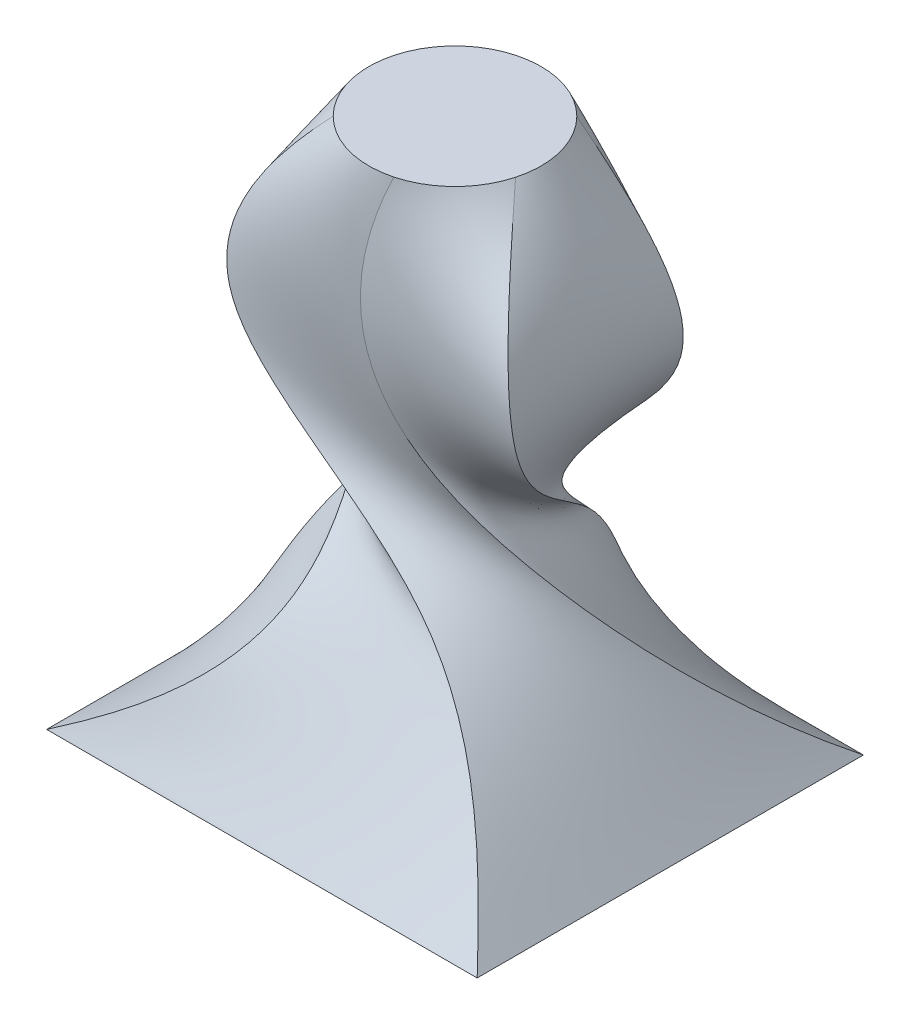
ISO-10303-21;
HEADER;
FILE_DESCRIPTION(('STEP AP214'),'2;1');
FILE_NAME('part.step','',(''),(''),'','','');
FILE_SCHEMA(('AUTOMOTIVE_DESIGN { 1 0 10303 214 1 1 1 1 }'));
ENDSEC;
DATA;
#1=APPLICATION_CONTEXT('core data for automotive mechanical design processes');
#2=APPLICATION_PROTOCOL_DEFINITION('international standard','automotive_design',2000,#1);
#3=PRODUCT_CONTEXT('',#1,'mechanical');
#4=PRODUCT('Part','Part','',(#3));
#5=PRODUCT_RELATED_PRODUCT_CATEGORY('part','',(#4));
#6=PRODUCT_DEFINITION_FORMATION('','',#4);
#7=PRODUCT_DEFINITION_CONTEXT('part definition',#1,'design');
#8=PRODUCT_DEFINITION('design','',#6,#7);
#9=PRODUCT_DEFINITION_SHAPE('','',#8);
#10=(LENGTH_UNIT() NAMED_UNIT(*) SI_UNIT(.MILLI.,.METRE.));
#11=(NAMED_UNIT(*) PLANE_ANGLE_UNIT() SI_UNIT($,.RADIAN.));
#12=(NAMED_UNIT(*) SI_UNIT($,.STERADIAN.) SOLID_ANGLE_UNIT());
#13=UNCERTAINTY_MEASURE_WITH_UNIT(LENGTH_MEASURE(1.E-05),#10,'distance_accuracy_value','');
#14=(GEOMETRIC_REPRESENTATION_CONTEXT(3) GLOBAL_UNCERTAINTY_ASSIGNED_CONTEXT((#13)) GLOBAL_UNIT_ASSIGNED_CONTEXT((#10,
#11,#12)) REPRESENTATION_CONTEXT('',''));
#15=CARTESIAN_POINT('',(0.,0.,0.));
#16=DIRECTION('',(0.,0.,1.));
#17=DIRECTION('',(1.,0.,0.));
#18=AXIS2_PLACEMENT_3D('',#15,#16,#17);
#19=CARTESIAN_POINT('',(0.,150.,0.));
#20=DIRECTION('',(0.,1.,0.));
#21=DIRECTION('',(0.,0.,1.));
#22=AXIS2_PLACEMENT_3D('',#19,#20,#21);
#23=PLANE('',#22);
#24=CARTESIAN_POINT('',(0.,150.,0.));
#25=DIRECTION('',(0.,1.,0.));
#26=DIRECTION('',(0.,0.,1.));
#27=AXIS2_PLACEMENT_3D('',#24,#25,#26);
#28=CIRCLE('',#27,23.8337887628549);
#29=CARTESIAN_POINT('',(-16.9034555283917,150.,16.8024604743494));
#30=VERTEX_POINT('',#29);
#31=CARTESIAN_POINT('',(6.09962985267464,150.,23.0400521365024));
#32=VERTEX_POINT('',#31);
#33=EDGE_CURVE('E12',#30,#32,#28,.T.);
#34=ORIENTED_EDGE('',*,*,#33,.T.);
#35=CARTESIAN_POINT('',(23.0030853810664,150.,6.23759166215305));
#36=VERTEX_POINT('',#35);
#37=EDGE_CURVE('E89',#32,#36,#28,.T.);
#38=ORIENTED_EDGE('',*,*,#37,.T.);
#39=CARTESIAN_POINT('',(16.9034555283917,150.,-16.8024604743494));
#40=VERTEX_POINT('',#39);
#41=EDGE_CURVE('E361',#36,#40,#28,.T.);
#42=ORIENTED_EDGE('',*,*,#41,.T.);
#43=CARTESIAN_POINT('',(-6.09962985267461,150.,-23.0400521365024));
#44=VERTEX_POINT('',#43);
#45=EDGE_CURVE('E103',#40,#44,#28,.T.);
#46=ORIENTED_EDGE('',*,*,#45,.T.);
#47=CARTESIAN_POINT('',(-23.0030853810663,150.,-6.23759166215306));
#48=VERTEX_POINT('',#47);
#49=EDGE_CURVE('E97',#44,#48,#28,.T.);
#50=ORIENTED_EDGE('',*,*,#49,.T.);
#51=EDGE_CURVE('E287',#48,#30,#28,.T.);
#52=ORIENTED_EDGE('',*,*,#51,.T.);
#53=EDGE_LOOP('',(#34,#38,#42,#46,#50,#52));
#54=FACE_BOUND('',#53,.T.);
#55=ADVANCED_FACE('F79',(#54),#23,.T.);
#56=CARTESIAN_POINT('',(0.,0.,0.));
#57=DIRECTION('',(0.,1.,0.));
#58=DIRECTION('',(0.,0.,1.));
#59=AXIS2_PLACEMENT_3D('',#56,#57,#58);
#60=PLANE('',#59);
#61=DIRECTION('',(0.,0.,-1.));
#62=VECTOR('',#61,1.);
#63=CARTESIAN_POINT('',(59.5670264226033,0.,-53.4309210286995));
#64=LINE('',#63,#62);
#65=CARTESIAN_POINT('',(59.5670264226033,0.,53.4309210286995));
#66=VERTEX_POINT('',#65);
#67=CARTESIAN_POINT('',(59.5670264226033,0.,-53.4309210286995));
#68=VERTEX_POINT('',#67);
#69=EDGE_CURVE('E141',#66,#68,#64,.T.);
#70=ORIENTED_EDGE('',*,*,#69,.F.);
#71=DIRECTION('',(1.,0.,0.));
#72=VECTOR('',#71,1.);
#73=CARTESIAN_POINT('',(-59.5670264226033,0.,53.4309210286995));
#74=LINE('',#73,#72);
#75=CARTESIAN_POINT('',(-59.5670264226033,0.,53.4309210286995));
#76=VERTEX_POINT('',#75);
#77=EDGE_CURVE('E161',#76,#66,#74,.T.);
#78=ORIENTED_EDGE('',*,*,#77,.F.);
#79=DIRECTION('',(0.,0.,1.));
#80=VECTOR('',#79,1.);
#81=CARTESIAN_POINT('',(-59.5670264226033,0.,-53.4309210286995));
#82=LINE('',#81,#80);
#83=CARTESIAN_POINT('',(-59.5670264226033,0.,0.));
#84=VERTEX_POINT('',#83);
#85=EDGE_CURVE('E314',#84,#76,#82,.T.);
#86=ORIENTED_EDGE('',*,*,#85,.F.);
#87=CARTESIAN_POINT('',(-59.5670264226033,0.,-53.4309210286995));
#88=VERTEX_POINT('',#87);
#89=EDGE_CURVE('E316',#88,#84,#82,.T.);
#90=ORIENTED_EDGE('',*,*,#89,.F.);
#91=DIRECTION('',(-1.,0.,0.));
#92=VECTOR('',#91,1.);
#93=CARTESIAN_POINT('',(-59.5670264226033,0.,-53.4309210286995));
#94=LINE('',#93,#92);
#95=CARTESIAN_POINT('',(0.,0.,-53.4309210286995));
#96=VERTEX_POINT('',#95);
#97=EDGE_CURVE('E144',#96,#88,#94,.T.);
#98=ORIENTED_EDGE('',*,*,#97,.F.);
#99=EDGE_CURVE('E136',#68,#96,#94,.T.);
#100=ORIENTED_EDGE('',*,*,#99,.F.);
#101=EDGE_LOOP('',(#70,#78,#86,#90,#98,#100));
#102=FACE_BOUND('',#101,.T.);
#103=ADVANCED_FACE('F139',(#102),#60,.F.);
#104=CARTESIAN_POINT('',(59.5670264226033,0.,53.4309210286995));
#105=CARTESIAN_POINT('',(46.0959471321574,16.7081441328809,38.903424040878));
#106=CARTESIAN_POINT('',(22.3961186460208,51.0631403674568,16.8336343953239));
#107=CARTESIAN_POINT('',(-55.1475026861152,94.0788605784358,25.4298173668123));
#108=CARTESIAN_POINT('',(-36.1275889103761,129.722432966398,19.7111501039679));
#109=CARTESIAN_POINT('',(-16.9034555283917,150.,16.8024604743494));
#110=CARTESIAN_POINT('',(59.5670264226033,0.,17.8103070095665));
#111=CARTESIAN_POINT('',(47.3113553078167,15.9915897572642,15.0856995329471));
#112=CARTESIAN_POINT('',(24.2616217957253,51.5089891655114,13.8565209864752));
#113=CARTESIAN_POINT('',(-37.6606846083582,93.6690785568848,22.6416853293649));
#114=CARTESIAN_POINT('',(-26.150087335538,130.276681246052,25.8389582922651));
#115=CARTESIAN_POINT('',(-10.9013909811891,150.,22.8406018112719));
#116=CARTESIAN_POINT('',(59.5670264226033,0.,-17.8103070095665));
#117=CARTESIAN_POINT('',(48.526763483476,15.2750353816475,-8.73202497498377));
#118=CARTESIAN_POINT('',(26.6473415157091,51.9548379635659,10.1917664360102));
#119=CARTESIAN_POINT('',(-21.8447302269555,93.2592965353338,22.0621615625648));
#120=CARTESIAN_POINT('',(-13.403845537056,130.830929525706,28.3069451734404));
#121=CARTESIAN_POINT('',(-2.13058621034253,150.,25.2189218410726));
#122=CARTESIAN_POINT('',(59.5670264226033,0.,-53.4309210286995));
#123=CARTESIAN_POINT('',(49.7421716591353,14.5584810060309,-32.5497494829146));
#124=CARTESIAN_POINT('',(28.9314904197971,52.4006867616205,5.67076484818119));
#125=CARTESIAN_POINT('',(-5.70254442851415,92.8495145137828,24.2327848913769));
#126=CARTESIAN_POINT('',(-1.1981924464033,131.38517780536,26.2177423202449));
#127=CARTESIAN_POINT('',(6.09962985267464,150.,23.0400521365024));
#128=B_SPLINE_SURFACE_WITH_KNOTS('',3,3,((#104,#105,#106,#107,#108,#109),(#110,#111,#112,#113,
#114,#115),(#116,#117,#118,#119,#120,#121),(#122,#123,#124,#125,#126,#127)),.UNSPECIFIED.,.F.,
.F.,.F.,(4,4),(4,1,1,4),(0.,1.),(0.,0.356849490359251,0.718008054138468,1.),.UNSPECIFIED.);
#129=CARTESIAN_POINT('',(59.5670264226033,0.,-53.4309210286995));
#130=CARTESIAN_POINT('',(49.7421716591353,14.5584810060309,-32.5497494829146));
#131=CARTESIAN_POINT('',(28.9314904197971,52.4006867616205,5.67076484818119));
#132=CARTESIAN_POINT('',(-5.70254442851415,92.8495145137828,24.2327848913769));
#133=CARTESIAN_POINT('',(-1.1981924464033,131.38517780536,26.2177423202449));
#134=CARTESIAN_POINT('',(6.09962985267464,150.,23.0400521365024));
#135=B_SPLINE_CURVE_WITH_KNOTS('',3,(#129,#130,#131,#132,#133,#134),.UNSPECIFIED.,.F.,.F.,(4,1,
1,4),(0.,0.356849490359251,0.718008054138468,1.),.UNSPECIFIED.);
#136=EDGE_CURVE('E160',#68,#32,#135,.T.);
#137=CARTESIAN_POINT('',(59.5670264226033,0.,53.4309210286995));
#138=CARTESIAN_POINT('',(46.0959471321574,16.7081441328809,38.903424040878));
#139=CARTESIAN_POINT('',(22.3961186460208,51.0631403674568,16.8336343953239));
#140=CARTESIAN_POINT('',(-55.1475026861152,94.0788605784358,25.4298173668123));
#141=CARTESIAN_POINT('',(-36.1275889103761,129.722432966398,19.7111501039679));
#142=CARTESIAN_POINT('',(-16.9034555283917,150.,16.8024604743494));
#143=B_SPLINE_CURVE_WITH_KNOTS('',3,(#137,#138,#139,#140,#141,#142),.UNSPECIFIED.,.F.,.F.,(4,1,
1,4),(0.,0.356849490359251,0.718008054138468,1.),.UNSPECIFIED.);
#144=EDGE_CURVE('E150',#30,#66,#143,.F.);
#145=ORIENTED_EDGE('',*,*,#69,.T.);
#146=ORIENTED_EDGE('',*,*,#136,.T.);
#147=ORIENTED_EDGE('',*,*,#33,.F.);
#148=ORIENTED_EDGE('',*,*,#144,.T.);
#149=EDGE_LOOP('',(#145,#146,#147,#148));
#150=FACE_BOUND('',#149,.T.);
#151=ADVANCED_FACE('F158',(#150),#128,.T.);
#152=CARTESIAN_POINT('',(59.5670264226033,0.,-53.4309210286995));
#153=CARTESIAN_POINT('',(49.7421716591353,14.5584810060309,-32.5497494829146));
#154=CARTESIAN_POINT('',(28.9314904197971,52.4006867616205,5.67076484818119));
#155=CARTESIAN_POINT('',(-5.70254442851415,92.8495145137828,24.2327848913769));
#156=CARTESIAN_POINT('',(-1.1981924464033,131.38517780536,26.2177423202449));
#157=CARTESIAN_POINT('',(6.09962985267464,150.,23.0400521365024));
#158=CARTESIAN_POINT('',(39.7113509484022,0.,-53.4309210286995));
#159=CARTESIAN_POINT('',(34.1859480473089,15.8713656069083,-36.8724884924259));
#160=CARTESIAN_POINT('',(22.0679222907747,51.6724545209744,-6.98364761240769));
#161=CARTESIAN_POINT('',(11.0193883435957,93.3155598941781,26.0450779223984));
#162=CARTESIAN_POINT('',(13.5627698278488,130.841549528575,27.9551237164246));
#163=CARTESIAN_POINT('',(14.3298459156918,150.,20.8611824319323));
#164=CARTESIAN_POINT('',(19.8556754742011,0.,-53.4309210286995));
#165=CARTESIAN_POINT('',(18.6297244354825,17.1842502077857,-41.1952275019371));
#166=CARTESIAN_POINT('',(14.8689477495648,50.9442222803284,-20.4324014091361));
#167=CARTESIAN_POINT('',(28.8186001369174,93.7816052745734,30.4086854960476));
#168=CARTESIAN_POINT('',(26.5386039886437,130.297921251791,25.4647950888878));
#169=CARTESIAN_POINT('',(20.7749338652518,150.,14.4546027036457));
#170=CARTESIAN_POINT('',(0.,0.,-53.4309210286995));
#171=CARTESIAN_POINT('',(3.07350082365616,18.4971348086631,-45.5179665114484));
#172=CARTESIAN_POINT('',(6.87765611413472,50.2159900396823,-34.2213158176978));
#173=CARTESIAN_POINT('',(49.1626248877026,94.2476506549688,35.8648419228349));
#174=CARTESIAN_POINT('',(35.2975017156931,129.754292975006,21.1640351481449));
#175=CARTESIAN_POINT('',(23.0030853810664,150.,6.23759166215305));
#176=B_SPLINE_SURFACE_WITH_KNOTS('',3,3,((#152,#153,#154,#155,#156,#157),(#158,#159,#160,#161,
#162,#163),(#164,#165,#166,#167,#168,#169),(#170,#171,#172,#173,#174,#175)),.UNSPECIFIED.,.F.,
.F.,.F.,(4,4),(4,1,1,4),(0.,1.),(0.,0.356849490359251,0.718008054138468,1.),.UNSPECIFIED.);
#177=CARTESIAN_POINT('',(0.,0.,-53.4309210286995));
#178=CARTESIAN_POINT('',(3.07350082365616,18.4971348086631,-45.5179665114484));
#179=CARTESIAN_POINT('',(6.87765611413472,50.2159900396823,-34.2213158176978));
#180=CARTESIAN_POINT('',(49.1626248877026,94.2476506549688,35.8648419228349));
#181=CARTESIAN_POINT('',(35.2975017156931,129.754292975006,21.1640351481449));
#182=CARTESIAN_POINT('',(23.0030853810664,150.,6.23759166215305));
#183=B_SPLINE_CURVE_WITH_KNOTS('',3,(#177,#178,#179,#180,#181,#182),.UNSPECIFIED.,.F.,.F.,(4,1,
1,4),(0.,0.356849490359251,0.718008054138468,1.),.UNSPECIFIED.);
#184=EDGE_CURVE('E168',#96,#36,#183,.T.);
#185=ORIENTED_EDGE('',*,*,#99,.T.);
#186=ORIENTED_EDGE('',*,*,#184,.T.);
#187=ORIENTED_EDGE('',*,*,#37,.F.);
#188=ORIENTED_EDGE('',*,*,#136,.F.);
#189=EDGE_LOOP('',(#185,#186,#187,#188));
#190=FACE_BOUND('',#189,.T.);
#191=ADVANCED_FACE('F166',(#190),#176,.T.);
#192=CARTESIAN_POINT('',(-59.5670264226033,0.,53.4309210286995));
#193=CARTESIAN_POINT('',(-32.142245211916,16.6196409916213,46.9447606634722));
#194=CARTESIAN_POINT('',(6.98468908568481,51.1113320281333,33.5409041425232));
#195=CARTESIAN_POINT('',(-52.2176500645772,94.0503325044536,-35.7148907588482));
#196=CARTESIAN_POINT('',(-35.2975017156931,129.754292975006,-21.1640351481449));
#197=CARTESIAN_POINT('',(-23.0030853810663,150.,-6.23759166215307));
#198=CARTESIAN_POINT('',(-19.8556754742011,0.,53.4309210286995));
#199=CARTESIAN_POINT('',(-6.0628477638915,16.6491420387078,44.2643151226074));
#200=CARTESIAN_POINT('',(11.3211681913775,51.0952681412411,28.0727095722849));
#201=CARTESIAN_POINT('',(-50.6226452799041,94.0598418624477,-15.6573832831325));
#202=CARTESIAN_POINT('',(-39.8355589139602,129.743672972137,-7.00197973478209));
#203=CARTESIAN_POINT('',(-25.2312368968809,150.,1.97941937933962));
#204=CARTESIAN_POINT('',(19.8556754742011,0.,53.4309210286995));
#205=CARTESIAN_POINT('',(20.016549684133,16.6786430857943,41.5838695817427));
#206=CARTESIAN_POINT('',(16.5132702795368,51.079204254349,22.7112151965698));
#207=CARTESIAN_POINT('',(-51.7757832127973,94.0693512204418,4.05741792060283));
#208=CARTESIAN_POINT('',(-39.8197477751262,129.733052969267,7.72796439517521));
#209=CARTESIAN_POINT('',(-22.9055200755943,150.,10.7643191374268));
#210=CARTESIAN_POINT('',(59.5670264226033,0.,53.4309210286995));
#211=CARTESIAN_POINT('',(46.0959471321574,16.7081441328809,38.903424040878));
#212=CARTESIAN_POINT('',(22.3961186460208,51.0631403674568,16.8336343953239));
#213=CARTESIAN_POINT('',(-55.1475026861152,94.0788605784358,25.4298173668123));
#214=CARTESIAN_POINT('',(-36.1275889103761,129.722432966398,19.7111501039679));
#215=CARTESIAN_POINT('',(-16.9034555283917,150.,16.8024604743494));
#216=B_SPLINE_SURFACE_WITH_KNOTS('',3,3,((#192,#193,#194,#195,#196,#197),(#198,#199,#200,#201,
#202,#203),(#204,#205,#206,#207,#208,#209),(#210,#211,#212,#213,#214,#215)),.UNSPECIFIED.,.F.,
.F.,.F.,(4,4),(4,1,1,4),(0.,1.),(0.,0.356849490359251,0.718008054138468,1.),.UNSPECIFIED.);
#217=CARTESIAN_POINT('',(-59.5670264226033,0.,53.4309210286995));
#218=CARTESIAN_POINT('',(-32.142245211916,16.6196409916213,46.9447606634722));
#219=CARTESIAN_POINT('',(6.98468908568481,51.1113320281333,33.5409041425232));
#220=CARTESIAN_POINT('',(-52.2176500645772,94.0503325044536,-35.7148907588482));
#221=CARTESIAN_POINT('',(-35.2975017156931,129.754292975006,-21.1640351481449));
#222=CARTESIAN_POINT('',(-23.0030853810663,150.,-6.23759166215306));
#223=B_SPLINE_CURVE_WITH_KNOTS('',3,(#217,#218,#219,#220,#221,#222),.UNSPECIFIED.,.F.,.F.,(4,1,
1,4),(0.,0.356849490359251,0.718008054138468,1.),.UNSPECIFIED.);
#224=EDGE_CURVE('E280',#76,#48,#223,.T.);
#225=ORIENTED_EDGE('',*,*,#77,.T.);
#226=ORIENTED_EDGE('',*,*,#144,.F.);
#227=ORIENTED_EDGE('',*,*,#51,.F.);
#228=ORIENTED_EDGE('',*,*,#224,.F.);
#229=EDGE_LOOP('',(#225,#226,#227,#228));
#230=FACE_BOUND('',#229,.T.);
#231=ADVANCED_FACE('F214',(#230),#216,.T.);
#232=CARTESIAN_POINT('',(0.,0.,-53.4309210286995));
#233=CARTESIAN_POINT('',(3.07350082365615,18.4971348086631,-45.5179665114484));
#234=CARTESIAN_POINT('',(6.87765611413471,50.2159900396823,-34.2213158176978));
#235=CARTESIAN_POINT('',(49.1626248877026,94.2476506549688,35.8648419228349));
#236=CARTESIAN_POINT('',(35.2975017156931,129.754292975006,21.1640351481449));
#237=CARTESIAN_POINT('',(23.0030853810664,150.,6.23759166215305));
#238=CARTESIAN_POINT('',(-19.8556754742011,0.,-53.4309210286995));
#239=CARTESIAN_POINT('',(-13.316315161615,17.9008045834023,-43.3131190212582));
#240=CARTESIAN_POINT('',(-2.07960472483116,50.4983734822738,-28.5263173557346));
#241=CARTESIAN_POINT('',(48.5859618286544,94.1913872961244,15.7573507257903));
#242=CARTESIAN_POINT('',(39.8355589139602,129.743672972137,7.00197973478206));
#243=CARTESIAN_POINT('',(25.2312368968809,150.,-1.97941937933964));
#244=CARTESIAN_POINT('',(-39.7113509484022,0.,-53.4309210286995));
#245=CARTESIAN_POINT('',(-29.7061311468862,17.3044743581416,-41.1082715310681));
#246=CARTESIAN_POINT('',(-11.8924885462637,50.7807569248653,-22.9380190882946));
#247=CARTESIAN_POINT('',(50.7574414871724,94.1351239372801,-4.00743419927396));
#248=CARTESIAN_POINT('',(39.8197477751262,129.733052969267,-7.72796439517523));
#249=CARTESIAN_POINT('',(22.9055200755944,150.,-10.7643191374268));
#250=CARTESIAN_POINT('',(-59.5670264226033,0.,-53.4309210286995));
#251=CARTESIAN_POINT('',(-46.0959471321574,16.7081441328809,-38.903424040878));
#252=CARTESIAN_POINT('',(-22.3961186460208,51.0631403674568,-16.8336343953239));
#253=CARTESIAN_POINT('',(55.1475026861152,94.0788605784358,-25.4298173668123));
#254=CARTESIAN_POINT('',(36.1275889103761,129.722432966398,-19.7111501039679));
#255=CARTESIAN_POINT('',(16.9034555283917,150.,-16.8024604743494));
#256=B_SPLINE_SURFACE_WITH_KNOTS('',3,3,((#232,#233,#234,#235,#236,#237),(#238,#239,#240,#241,
#242,#243),(#244,#245,#246,#247,#248,#249),(#250,#251,#252,#253,#254,#255)),.UNSPECIFIED.,.F.,
.F.,.F.,(4,4),(4,1,1,4),(0.,1.),(0.,0.356849490359251,0.718008054138468,1.),.UNSPECIFIED.);
#257=CARTESIAN_POINT('',(-59.5670264226033,0.,-53.4309210286995));
#258=CARTESIAN_POINT('',(-46.0959471321574,16.7081441328809,-38.903424040878));
#259=CARTESIAN_POINT('',(-22.3961186460208,51.0631403674568,-16.8336343953239));
#260=CARTESIAN_POINT('',(55.1475026861152,94.0788605784358,-25.4298173668123));
#261=CARTESIAN_POINT('',(36.1275889103761,129.722432966398,-19.7111501039679));
#262=CARTESIAN_POINT('',(16.9034555283917,150.,-16.8024604743494));
#263=B_SPLINE_CURVE_WITH_KNOTS('',3,(#257,#258,#259,#260,#261,#262),.UNSPECIFIED.,.F.,.F.,(4,1,
1,4),(0.,0.356849490359251,0.718008054138468,1.),.UNSPECIFIED.);
#264=EDGE_CURVE('E170',#88,#40,#263,.T.);
#265=ORIENTED_EDGE('',*,*,#97,.T.);
#266=ORIENTED_EDGE('',*,*,#264,.T.);
#267=ORIENTED_EDGE('',*,*,#41,.F.);
#268=ORIENTED_EDGE('',*,*,#184,.F.);
#269=EDGE_LOOP('',(#265,#266,#267,#268));
#270=FACE_BOUND('',#269,.T.);
#271=ADVANCED_FACE('F201',(#270),#256,.T.);
#272=CARTESIAN_POINT('',(-59.5670264226033,0.,-53.4309210286995));
#273=CARTESIAN_POINT('',(-46.0959471321574,16.7081441328809,-38.903424040878));
#274=CARTESIAN_POINT('',(-22.3961186460208,51.0631403674568,-16.8336343953239));
#275=CARTESIAN_POINT('',(55.1475026861152,94.0788605784358,-25.4298173668123));
#276=CARTESIAN_POINT('',(36.1275889103761,129.722432966398,-19.7111501039679));
#277=CARTESIAN_POINT('',(16.9034555283917,150.,-16.8024604743494));
#278=CARTESIAN_POINT('',(-59.5670264226033,0.,-35.620614019133));
#279=CARTESIAN_POINT('',(-46.8138894680719,16.8267260224447,-24.5547649469292));
#280=CARTESIAN_POINT('',(-24.4988540305805,51.1107281659239,-9.34089926800477));
#281=CARTESIAN_POINT('',(37.7129665591971,93.7568485094555,-23.6368515757911));
#282=CARTESIAN_POINT('',(26.150087335538,130.276681246052,-25.8389582922651));
#283=CARTESIAN_POINT('',(10.9013909811891,150.,-22.8406018112719));
#284=CARTESIAN_POINT('',(-59.5670264226033,0.,-17.8103070095665));
#285=CARTESIAN_POINT('',(-47.5318318039864,16.9453079120085,-10.2061058529804));
#286=CARTESIAN_POINT('',(-27.1218059854194,51.1583159643911,-1.16052299906936));
#287=CARTESIAN_POINT('',(21.9492941286333,93.4348364404752,-24.0524940554173));
#288=CARTESIAN_POINT('',(13.403845537056,130.830929525706,-28.3069451734404));
#289=CARTESIAN_POINT('',(2.13058621034257,150.,-25.2189218410726));
#290=CARTESIAN_POINT('',(-59.5670264226033,0.,0.));
#291=CARTESIAN_POINT('',(-48.2497741399008,17.0638898015724,4.14255324096832));
#292=CARTESIAN_POINT('',(-29.6431871243627,51.2059037628582,7.8761003072301));
#293=CARTESIAN_POINT('',(5.8593902810309,93.1128243714949,-27.2182836306556));
#294=CARTESIAN_POINT('',(1.19819244640336,131.38517780536,-26.217742320245));
#295=CARTESIAN_POINT('',(-6.0996298526746,150.,-23.0400521365025));
#296=B_SPLINE_SURFACE_WITH_KNOTS('',3,3,((#272,#273,#274,#275,#276,#277),(#278,#279,#280,#281,
#282,#283),(#284,#285,#286,#287,#288,#289),(#290,#291,#292,#293,#294,#295)),.UNSPECIFIED.,.F.,
.F.,.F.,(4,4),(4,1,1,4),(0.,1.),(0.,0.356849490359251,0.718008054138468,1.),.UNSPECIFIED.);
#297=CARTESIAN_POINT('',(-59.5670264226033,0.,0.));
#298=CARTESIAN_POINT('',(-48.2497741399008,17.0638898015724,4.14255324096832));
#299=CARTESIAN_POINT('',(-29.6431871243627,51.2059037628582,7.8761003072301));
#300=CARTESIAN_POINT('',(5.8593902810309,93.1128243714949,-27.2182836306556));
#301=CARTESIAN_POINT('',(1.19819244640336,131.38517780536,-26.217742320245));
#302=CARTESIAN_POINT('',(-6.0996298526746,150.,-23.0400521365025));
#303=B_SPLINE_CURVE_WITH_KNOTS('',3,(#297,#298,#299,#300,#301,#302),.UNSPECIFIED.,.F.,.F.,(4,1,
1,4),(0.,0.356849490359251,0.718008054138468,1.),.UNSPECIFIED.);
#304=EDGE_CURVE('E288',#84,#44,#303,.T.);
#305=ORIENTED_EDGE('',*,*,#89,.T.);
#306=ORIENTED_EDGE('',*,*,#304,.T.);
#307=ORIENTED_EDGE('',*,*,#45,.F.);
#308=ORIENTED_EDGE('',*,*,#264,.F.);
#309=EDGE_LOOP('',(#305,#306,#307,#308));
#310=FACE_BOUND('',#309,.T.);
#311=ADVANCED_FACE('F213',(#310),#296,.T.);
#312=CARTESIAN_POINT('',(-59.5670264226033,0.,0.));
#313=CARTESIAN_POINT('',(-48.2497741399008,17.0638898015724,4.14255324096833));
#314=CARTESIAN_POINT('',(-29.6431871243627,51.2059037628582,7.87610030723011));
#315=CARTESIAN_POINT('',(5.85939028103091,93.1128243714949,-27.2182836306556));
#316=CARTESIAN_POINT('',(1.19819244640335,131.38517780536,-26.217742320245));
#317=CARTESIAN_POINT('',(-6.0996298526746,150.,-23.0400521365024));
#318=CARTESIAN_POINT('',(-59.5670264226033,0.,17.8103070095665));
#319=CARTESIAN_POINT('',(-42.8805978305725,16.915806864922,18.4099557151363));
#320=CARTESIAN_POINT('',(-17.9216050272119,51.1743798512833,15.7880871576237));
#321=CARTESIAN_POINT('',(-11.9331661675427,93.4253270824811,-27.985426693922));
#322=CARTESIAN_POINT('',(-13.5627698278487,130.841549528575,-27.9551237164246));
#323=CARTESIAN_POINT('',(-14.3298459156918,150.,-20.8611824319323));
#324=CARTESIAN_POINT('',(-59.5670264226033,0.,35.620614019133));
#325=CARTESIAN_POINT('',(-37.5114215212443,16.7677239282717,32.6773581893042));
#326=CARTESIAN_POINT('',(-5.86461651787369,51.1428559397083,24.4944153441568));
#327=CARTESIAN_POINT('',(-30.8030016373283,93.7378297934674,-31.3038842998161));
#328=CARTESIAN_POINT('',(-26.5386039886436,130.297921251791,-25.4647950888878));
#329=CARTESIAN_POINT('',(-20.7749338652518,150.,-14.4546027036458));
#330=CARTESIAN_POINT('',(-59.5670264226033,0.,53.4309210286995));
#331=CARTESIAN_POINT('',(-32.142245211916,16.6196409916213,46.9447606634722));
#332=CARTESIAN_POINT('',(6.98468908568481,51.1113320281333,33.5409041425232));
#333=CARTESIAN_POINT('',(-52.2176500645772,94.0503325044536,-35.7148907588482));
#334=CARTESIAN_POINT('',(-35.2975017156931,129.754292975006,-21.1640351481449));
#335=CARTESIAN_POINT('',(-23.0030853810663,150.,-6.23759166215306));
#336=B_SPLINE_SURFACE_WITH_KNOTS('',3,3,((#312,#313,#314,#315,#316,#317),(#318,#319,#320,#321,
#322,#323),(#324,#325,#326,#327,#328,#329),(#330,#331,#332,#333,#334,#335)),.UNSPECIFIED.,.F.,
.F.,.F.,(4,4),(4,1,1,4),(0.,1.),(0.,0.356849490359251,0.718008054138468,1.),.UNSPECIFIED.);
#337=ORIENTED_EDGE('',*,*,#85,.T.);
#338=ORIENTED_EDGE('',*,*,#224,.T.);
#339=ORIENTED_EDGE('',*,*,#49,.F.);
#340=ORIENTED_EDGE('',*,*,#304,.F.);
#341=EDGE_LOOP('',(#337,#338,#339,#340));
#342=FACE_BOUND('',#341,.T.);
#343=ADVANCED_FACE('F258',(#342),#336,.T.);
#344=CLOSED_SHELL('',(#55,#103,#151,#191,#231,#271,#311,#343));
#345=MANIFOLD_SOLID_BREP('B2',#344);
#346=ADVANCED_BREP_SHAPE_REPRESENTATION('',(#18,#345),#14);
#347=SHAPE_DEFINITION_REPRESENTATION(#9,#346);
ENDSEC;
END-ISO-10303-21;
